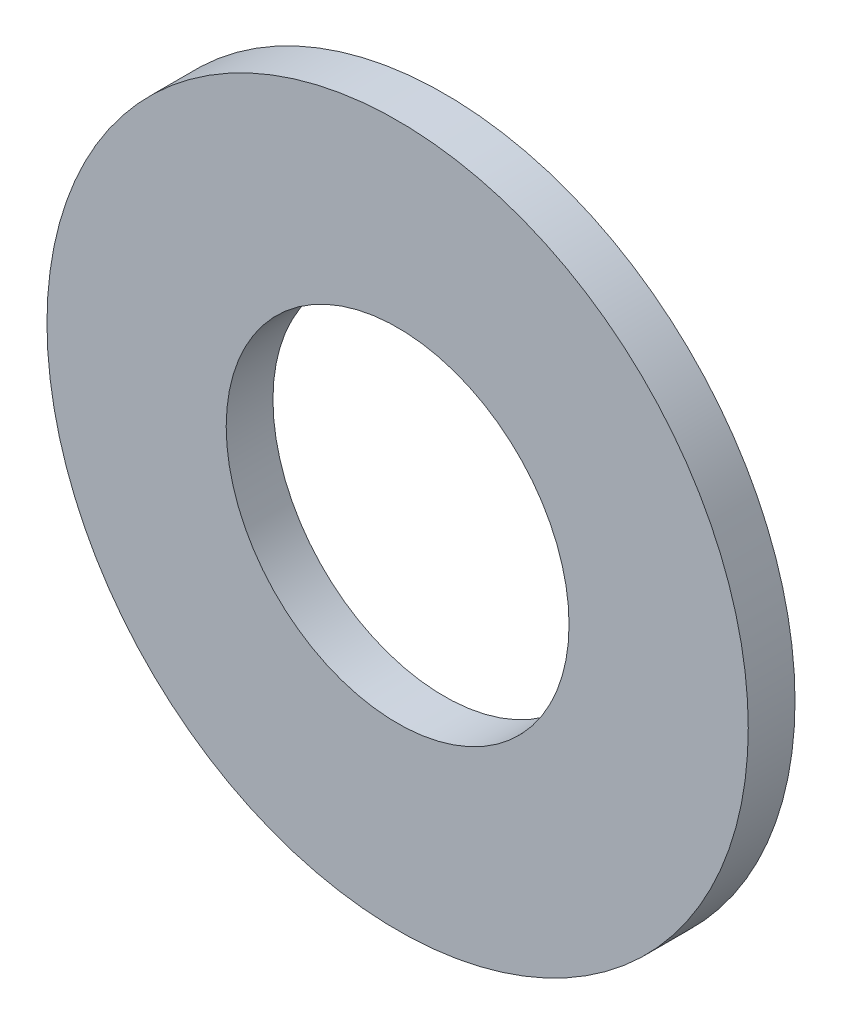
ISO-10303-21;
HEADER;
FILE_DESCRIPTION(('STEP AP214'),'2;1');
FILE_NAME('part.step','',(''),(''),'','','');
FILE_SCHEMA(('AUTOMOTIVE_DESIGN { 1 0 10303 214 1 1 1 1 }'));
ENDSEC;
DATA;
#1=APPLICATION_CONTEXT('core data for automotive mechanical design processes');
#2=APPLICATION_PROTOCOL_DEFINITION('international standard','automotive_design',2000,#1);
#3=PRODUCT_CONTEXT('',#1,'mechanical');
#4=PRODUCT('Part','Part','',(#3));
#5=PRODUCT_RELATED_PRODUCT_CATEGORY('part','',(#4));
#6=PRODUCT_DEFINITION_FORMATION('','',#4);
#7=PRODUCT_DEFINITION_CONTEXT('part definition',#1,'design');
#8=PRODUCT_DEFINITION('design','',#6,#7);
#9=PRODUCT_DEFINITION_SHAPE('','',#8);
#10=(LENGTH_UNIT() NAMED_UNIT(*) SI_UNIT(.MILLI.,.METRE.));
#11=(NAMED_UNIT(*) PLANE_ANGLE_UNIT() SI_UNIT($,.RADIAN.));
#12=(NAMED_UNIT(*) SI_UNIT($,.STERADIAN.) SOLID_ANGLE_UNIT());
#13=UNCERTAINTY_MEASURE_WITH_UNIT(LENGTH_MEASURE(1.E-05),#10,'distance_accuracy_value','');
#14=(GEOMETRIC_REPRESENTATION_CONTEXT(3) GLOBAL_UNCERTAINTY_ASSIGNED_CONTEXT((#13)) GLOBAL_UNIT_ASSIGNED_CONTEXT((#10,
#11,#12)) REPRESENTATION_CONTEXT('',''));
#15=CARTESIAN_POINT('',(0.,0.,0.));
#16=DIRECTION('',(0.,0.,1.));
#17=DIRECTION('',(1.,0.,0.));
#18=AXIS2_PLACEMENT_3D('',#15,#16,#17);
#19=CARTESIAN_POINT('',(0.,0.,0.15));
#20=DIRECTION('',(0.,0.,1.));
#21=DIRECTION('',(1.,0.,0.));
#22=AXIS2_PLACEMENT_3D('',#19,#20,#21);
#23=PLANE('',#22);
#24=CARTESIAN_POINT('',(0.,0.,0.15));
#25=DIRECTION('',(0.,0.,1.));
#26=DIRECTION('',(1.,0.,0.));
#27=AXIS2_PLACEMENT_3D('',#24,#25,#26);
#28=CIRCLE('',#27,2.25);
#29=CARTESIAN_POINT('',(2.25,0.,0.15));
#30=VERTEX_POINT('',#29);
#31=EDGE_CURVE('E10',#30,#30,#28,.T.);
#32=ORIENTED_EDGE('',*,*,#31,.T.);
#33=EDGE_LOOP('',(#32));
#34=FACE_BOUND('',#33,.T.);
#35=CARTESIAN_POINT('',(0.,0.,0.15));
#36=DIRECTION('',(0.,0.,1.));
#37=DIRECTION('',(1.,0.,0.));
#38=AXIS2_PLACEMENT_3D('',#35,#36,#37);
#39=CIRCLE('',#38,1.1);
#40=CARTESIAN_POINT('',(1.1,0.,0.15));
#41=VERTEX_POINT('',#40);
#42=EDGE_CURVE('E56',#41,#41,#39,.T.);
#43=ORIENTED_EDGE('',*,*,#42,.F.);
#44=EDGE_LOOP('',(#43));
#45=FACE_BOUND('',#44,.T.);
#46=ADVANCED_FACE('F43',(#34,#45),#23,.T.);
#47=CARTESIAN_POINT('',(0.,0.,-0.15));
#48=DIRECTION('',(0.,0.,1.));
#49=DIRECTION('',(1.,0.,0.));
#50=AXIS2_PLACEMENT_3D('',#47,#48,#49);
#51=PLANE('',#50);
#52=CARTESIAN_POINT('',(0.,0.,-0.15));
#53=DIRECTION('',(0.,0.,1.));
#54=DIRECTION('',(1.,0.,0.));
#55=AXIS2_PLACEMENT_3D('',#52,#53,#54);
#56=CIRCLE('',#55,2.25);
#57=CARTESIAN_POINT('',(2.25,0.,-0.15));
#58=VERTEX_POINT('',#57);
#59=EDGE_CURVE('E47',#58,#58,#56,.T.);
#60=ORIENTED_EDGE('',*,*,#59,.F.);
#61=EDGE_LOOP('',(#60));
#62=FACE_BOUND('',#61,.T.);
#63=CARTESIAN_POINT('',(0.,0.,-0.15));
#64=DIRECTION('',(0.,0.,1.));
#65=DIRECTION('',(1.,0.,0.));
#66=AXIS2_PLACEMENT_3D('',#63,#64,#65);
#67=CIRCLE('',#66,1.1);
#68=CARTESIAN_POINT('',(1.1,0.,-0.15));
#69=VERTEX_POINT('',#68);
#70=EDGE_CURVE('E58',#69,#69,#67,.T.);
#71=ORIENTED_EDGE('',*,*,#70,.T.);
#72=EDGE_LOOP('',(#71));
#73=FACE_BOUND('',#72,.T.);
#74=ADVANCED_FACE('F70',(#62,#73),#51,.F.);
#75=CARTESIAN_POINT('',(0.,0.,0.15));
#76=DIRECTION('',(0.,0.,-1.));
#77=DIRECTION('',(-1.,0.,0.));
#78=AXIS2_PLACEMENT_3D('',#75,#76,#77);
#79=CYLINDRICAL_SURFACE('',#78,2.25);
#80=ORIENTED_EDGE('',*,*,#31,.F.);
#81=EDGE_LOOP('',(#80));
#82=FACE_BOUND('',#81,.T.);
#83=ORIENTED_EDGE('',*,*,#59,.T.);
#84=EDGE_LOOP('',(#83));
#85=FACE_BOUND('',#84,.T.);
#86=ADVANCED_FACE('F45',(#82,#85),#79,.T.);
#87=CARTESIAN_POINT('',(0.,0.,0.15));
#88=DIRECTION('',(0.,0.,-1.));
#89=DIRECTION('',(-1.,0.,0.));
#90=AXIS2_PLACEMENT_3D('',#87,#88,#89);
#91=CYLINDRICAL_SURFACE('',#90,1.1);
#92=ORIENTED_EDGE('',*,*,#42,.T.);
#93=EDGE_LOOP('',(#92));
#94=FACE_BOUND('',#93,.T.);
#95=ORIENTED_EDGE('',*,*,#70,.F.);
#96=EDGE_LOOP('',(#95));
#97=FACE_BOUND('',#96,.T.);
#98=ADVANCED_FACE('F66',(#94,#97),#91,.F.);
#99=CLOSED_SHELL('',(#46,#74,#86,#98));
#100=MANIFOLD_SOLID_BREP('B2',#99);
#101=ADVANCED_BREP_SHAPE_REPRESENTATION('',(#18,#100),#14);
#102=SHAPE_DEFINITION_REPRESENTATION(#9,#101);
ENDSEC;
END-ISO-10303-21;
